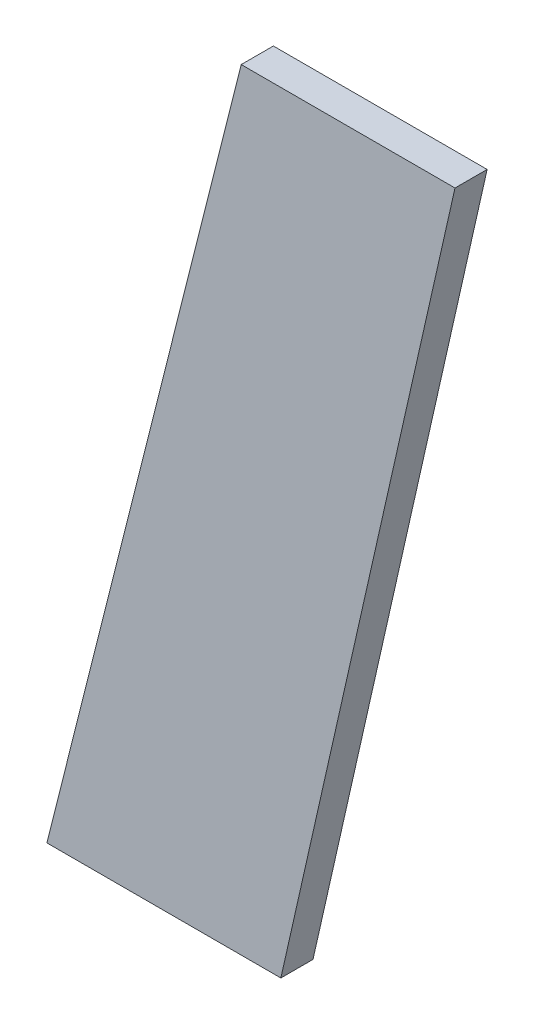
ISO-10303-21;
HEADER;
FILE_DESCRIPTION(('STEP AP214'),'2;1');
FILE_NAME('part.step','',(''),(''),'','','');
FILE_SCHEMA(('AUTOMOTIVE_DESIGN { 1 0 10303 214 1 1 1 1 }'));
ENDSEC;
DATA;
#1=APPLICATION_CONTEXT('core data for automotive mechanical design processes');
#2=APPLICATION_PROTOCOL_DEFINITION('international standard','automotive_design',2000,#1);
#3=PRODUCT_CONTEXT('',#1,'mechanical');
#4=PRODUCT('Part','Part','',(#3));
#5=PRODUCT_RELATED_PRODUCT_CATEGORY('part','',(#4));
#6=PRODUCT_DEFINITION_FORMATION('','',#4);
#7=PRODUCT_DEFINITION_CONTEXT('part definition',#1,'design');
#8=PRODUCT_DEFINITION('design','',#6,#7);
#9=PRODUCT_DEFINITION_SHAPE('','',#8);
#10=(LENGTH_UNIT() NAMED_UNIT(*) SI_UNIT(.MILLI.,.METRE.));
#11=(NAMED_UNIT(*) PLANE_ANGLE_UNIT() SI_UNIT($,.RADIAN.));
#12=(NAMED_UNIT(*) SI_UNIT($,.STERADIAN.) SOLID_ANGLE_UNIT());
#13=UNCERTAINTY_MEASURE_WITH_UNIT(LENGTH_MEASURE(1.E-05),#10,'distance_accuracy_value','');
#14=(GEOMETRIC_REPRESENTATION_CONTEXT(3) GLOBAL_UNCERTAINTY_ASSIGNED_CONTEXT((#13)) GLOBAL_UNIT_ASSIGNED_CONTEXT((#10,
#11,#12)) REPRESENTATION_CONTEXT('',''));
#15=CARTESIAN_POINT('',(0.,0.,0.));
#16=DIRECTION('',(0.,0.,1.));
#17=DIRECTION('',(1.,0.,0.));
#18=AXIS2_PLACEMENT_3D('',#15,#16,#17);
#19=CARTESIAN_POINT('',(-12.8655849358985,-12.5,0.5));
#20=DIRECTION('',(0.,1.,0.));
#21=DIRECTION('',(0.,0.,1.));
#22=AXIS2_PLACEMENT_3D('',#19,#20,#21);
#23=PLANE('',#22);
#24=DIRECTION('',(-1.,0.,0.));
#25=VECTOR('',#24,1.);
#26=CARTESIAN_POINT('',(-12.8655849358985,-12.5,1.));
#27=LINE('',#26,#25);
#28=CARTESIAN_POINT('',(-12.8655849358985,-12.5,1.));
#29=VERTEX_POINT('',#28);
#30=CARTESIAN_POINT('',(-16.5064102564113,-12.5,1.));
#31=VERTEX_POINT('',#30);
#32=EDGE_CURVE('E110',#29,#31,#27,.T.);
#33=ORIENTED_EDGE('',*,*,#32,.T.);
#34=DIRECTION('',(0.,0.,1.));
#35=VECTOR('',#34,1.);
#36=CARTESIAN_POINT('',(-16.5064102564113,-12.5,0.5));
#37=LINE('',#36,#35);
#38=CARTESIAN_POINT('',(-16.5064102564113,-12.5,0.5));
#39=VERTEX_POINT('',#38);
#40=EDGE_CURVE('E83',#39,#31,#37,.T.);
#41=ORIENTED_EDGE('',*,*,#40,.F.);
#42=DIRECTION('',(-1.,0.,0.));
#43=VECTOR('',#42,1.);
#44=CARTESIAN_POINT('',(-12.8655849358985,-12.5,0.5));
#45=LINE('',#44,#43);
#46=CARTESIAN_POINT('',(-12.8655849358985,-12.5,0.5));
#47=VERTEX_POINT('',#46);
#48=EDGE_CURVE('E91',#47,#39,#45,.T.);
#49=ORIENTED_EDGE('',*,*,#48,.F.);
#50=DIRECTION('',(0.,0.,1.));
#51=VECTOR('',#50,1.);
#52=CARTESIAN_POINT('',(-12.8655849358985,-12.5,0.5));
#53=LINE('',#52,#51);
#54=EDGE_CURVE('E107',#47,#29,#53,.T.);
#55=ORIENTED_EDGE('',*,*,#54,.T.);
#56=EDGE_LOOP('',(#33,#41,#49,#55));
#57=FACE_BOUND('',#56,.T.);
#58=ADVANCED_FACE('F39',(#57),#23,.F.);
#59=CARTESIAN_POINT('',(8.58165516531608,6.47238776818213,0.5));
#60=DIRECTION('',(0.,0.,1.));
#61=DIRECTION('',(1.,0.,0.));
#62=AXIS2_PLACEMENT_3D('',#59,#60,#61);
#63=PLANE('',#62);
#64=DIRECTION('',(0.244363406533017,0.969683724493497,0.));
#65=VECTOR('',#64,1.);
#66=CARTESIAN_POINT('',(-16.5064102564113,-12.5,0.5));
#67=LINE('',#66,#65);
#68=CARTESIAN_POINT('',(-13.4823717948728,-0.5,0.499999999999413));
#69=VERTEX_POINT('',#68);
#70=EDGE_CURVE('E103',#39,#69,#67,.T.);
#71=ORIENTED_EDGE('',*,*,#70,.T.);
#72=DIRECTION('',(1.,0.,0.));
#73=VECTOR('',#72,1.);
#74=CARTESIAN_POINT('',(8.58165516531608,-0.5,0.499999999999922));
#75=LINE('',#74,#73);
#76=CARTESIAN_POINT('',(-10.1560261123691,-0.5,0.499999999999496));
#77=VERTEX_POINT('',#76);
#78=EDGE_CURVE('E43',#69,#77,#75,.T.);
#79=ORIENTED_EDGE('',*,*,#78,.T.);
#80=DIRECTION('',(-0.220251698832426,-0.975443073255139,0.));
#81=VECTOR('',#80,1.);
#82=CARTESIAN_POINT('',(-9.17467948718053,3.84615384615385,0.5));
#83=LINE('',#82,#81);
#84=EDGE_CURVE('E93',#77,#47,#83,.T.);
#85=ORIENTED_EDGE('',*,*,#84,.T.);
#86=ORIENTED_EDGE('',*,*,#48,.T.);
#87=EDGE_LOOP('',(#71,#79,#85,#86));
#88=FACE_BOUND('',#87,.T.);
#89=ADVANCED_FACE('F115',(#88),#63,.F.);
#90=CARTESIAN_POINT('',(-16.5064102564113,-12.5,0.5));
#91=DIRECTION('',(0.969683724493497,-0.244363406533017,0.));
#92=DIRECTION('',(0.244363406533017,0.969683724493497,0.));
#93=AXIS2_PLACEMENT_3D('',#90,#91,#92);
#94=PLANE('',#93);
#95=DIRECTION('',(0.244363406533017,0.969683724493497,0.));
#96=VECTOR('',#95,1.);
#97=CARTESIAN_POINT('',(-16.5064102564113,-12.5,1.));
#98=LINE('',#97,#96);
#99=CARTESIAN_POINT('',(-13.4823717948728,-0.5,1.));
#100=VERTEX_POINT('',#99);
#101=EDGE_CURVE('E85',#31,#100,#98,.T.);
#102=ORIENTED_EDGE('',*,*,#101,.T.);
#103=DIRECTION('',(0.,0.,-1.));
#104=VECTOR('',#103,1.);
#105=CARTESIAN_POINT('',(-13.4823717948728,-0.5,0.5));
#106=LINE('',#105,#104);
#107=EDGE_CURVE('E73',#100,#69,#106,.T.);
#108=ORIENTED_EDGE('',*,*,#107,.T.);
#109=ORIENTED_EDGE('',*,*,#70,.F.);
#110=ORIENTED_EDGE('',*,*,#40,.T.);
#111=EDGE_LOOP('',(#102,#108,#109,#110));
#112=FACE_BOUND('',#111,.T.);
#113=ADVANCED_FACE('F87',(#112),#94,.F.);
#114=CARTESIAN_POINT('',(-9.17467948718053,3.84615384615385,0.5));
#115=DIRECTION('',(-0.975443073255139,0.220251698832426,0.));
#116=DIRECTION('',(-0.220251698832426,-0.975443073255139,0.));
#117=AXIS2_PLACEMENT_3D('',#114,#115,#116);
#118=PLANE('',#117);
#119=ORIENTED_EDGE('',*,*,#84,.F.);
#120=DIRECTION('',(0.,0.,1.));
#121=VECTOR('',#120,1.);
#122=CARTESIAN_POINT('',(-10.1560261123691,-0.5,0.5));
#123=LINE('',#122,#121);
#124=CARTESIAN_POINT('',(-10.1560261123691,-0.5,1.));
#125=VERTEX_POINT('',#124);
#126=EDGE_CURVE('E57',#77,#125,#123,.T.);
#127=ORIENTED_EDGE('',*,*,#126,.T.);
#128=DIRECTION('',(-0.220251698832426,-0.975443073255139,0.));
#129=VECTOR('',#128,1.);
#130=CARTESIAN_POINT('',(-9.17467948718053,3.84615384615385,1.));
#131=LINE('',#130,#129);
#132=EDGE_CURVE('E47',#125,#29,#131,.T.);
#133=ORIENTED_EDGE('',*,*,#132,.T.);
#134=ORIENTED_EDGE('',*,*,#54,.F.);
#135=EDGE_LOOP('',(#119,#127,#133,#134));
#136=FACE_BOUND('',#135,.T.);
#137=ADVANCED_FACE('F111',(#136),#118,.F.);
#138=CARTESIAN_POINT('',(8.58165516531608,6.47238776818213,1.));
#139=DIRECTION('',(0.,0.,1.));
#140=DIRECTION('',(1.,0.,0.));
#141=AXIS2_PLACEMENT_3D('',#138,#139,#140);
#142=PLANE('',#141);
#143=ORIENTED_EDGE('',*,*,#132,.F.);
#144=DIRECTION('',(-1.,0.,0.));
#145=VECTOR('',#144,1.);
#146=CARTESIAN_POINT('',(-17.,-0.5,1.));
#147=LINE('',#146,#145);
#148=EDGE_CURVE('E11',#125,#100,#147,.T.);
#149=ORIENTED_EDGE('',*,*,#148,.T.);
#150=ORIENTED_EDGE('',*,*,#101,.F.);
#151=ORIENTED_EDGE('',*,*,#32,.F.);
#152=EDGE_LOOP('',(#143,#149,#150,#151));
#153=FACE_BOUND('',#152,.T.);
#154=ADVANCED_FACE('F41',(#153),#142,.T.);
#155=CARTESIAN_POINT('',(-17.,-0.5,1.));
#156=DIRECTION('',(0.,-1.,0.));
#157=DIRECTION('',(0.,0.,-1.));
#158=AXIS2_PLACEMENT_3D('',#155,#156,#157);
#159=PLANE('',#158);
#160=ORIENTED_EDGE('',*,*,#78,.F.);
#161=ORIENTED_EDGE('',*,*,#107,.F.);
#162=ORIENTED_EDGE('',*,*,#148,.F.);
#163=ORIENTED_EDGE('',*,*,#126,.F.);
#164=EDGE_LOOP('',(#160,#161,#162,#163));
#165=FACE_BOUND('',#164,.T.);
#166=ADVANCED_FACE('F78',(#165),#159,.F.);
#167=CLOSED_SHELL('',(#58,#89,#113,#137,#154,#166));
#168=MANIFOLD_SOLID_BREP('B2',#167);
#169=ADVANCED_BREP_SHAPE_REPRESENTATION('',(#18,#168),#14);
#170=SHAPE_DEFINITION_REPRESENTATION(#9,#169);
ENDSEC;
END-ISO-10303-21;
